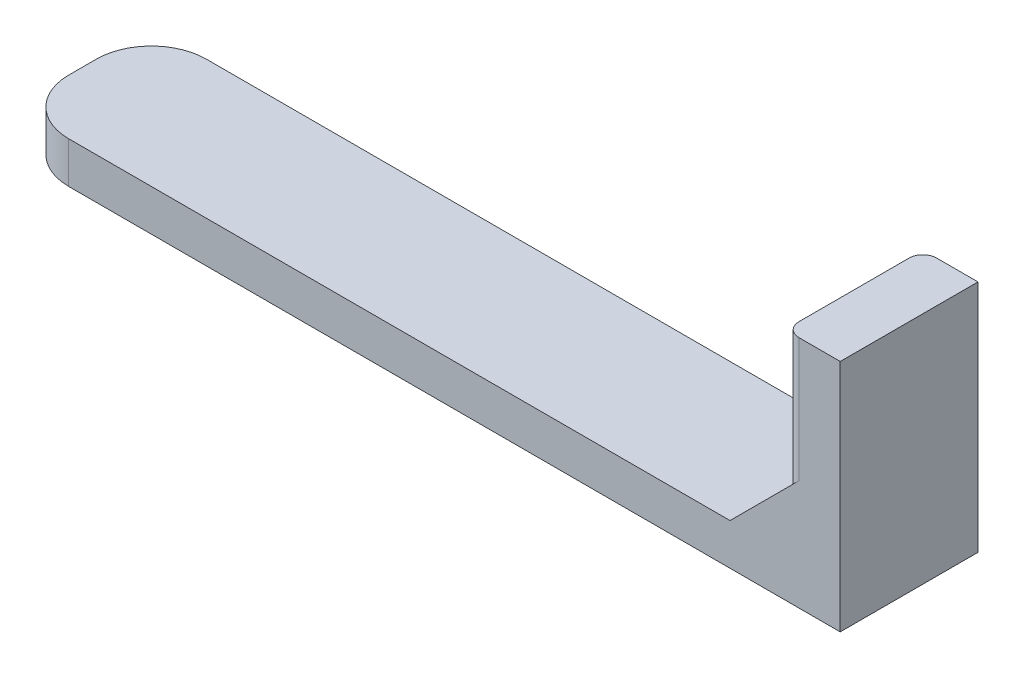
ISO-10303-21;
HEADER;
FILE_DESCRIPTION(('STEP AP214'),'2;1');
FILE_NAME('part.step','',(''),(''),'','','');
FILE_SCHEMA(('AUTOMOTIVE_DESIGN { 1 0 10303 214 1 1 1 1 }'));
ENDSEC;
DATA;
#1=APPLICATION_CONTEXT('core data for automotive mechanical design processes');
#2=APPLICATION_PROTOCOL_DEFINITION('international standard','automotive_design',2000,#1);
#3=PRODUCT_CONTEXT('',#1,'mechanical');
#4=PRODUCT('Part','Part','',(#3));
#5=PRODUCT_RELATED_PRODUCT_CATEGORY('part','',(#4));
#6=PRODUCT_DEFINITION_FORMATION('','',#4);
#7=PRODUCT_DEFINITION_CONTEXT('part definition',#1,'design');
#8=PRODUCT_DEFINITION('design','',#6,#7);
#9=PRODUCT_DEFINITION_SHAPE('','',#8);
#10=(LENGTH_UNIT() NAMED_UNIT(*) SI_UNIT(.MILLI.,.METRE.));
#11=(NAMED_UNIT(*) PLANE_ANGLE_UNIT() SI_UNIT($,.RADIAN.));
#12=(NAMED_UNIT(*) SI_UNIT($,.STERADIAN.) SOLID_ANGLE_UNIT());
#13=UNCERTAINTY_MEASURE_WITH_UNIT(LENGTH_MEASURE(1.E-05),#10,'distance_accuracy_value','');
#14=(GEOMETRIC_REPRESENTATION_CONTEXT(3) GLOBAL_UNCERTAINTY_ASSIGNED_CONTEXT((#13)) GLOBAL_UNIT_ASSIGNED_CONTEXT((#10,
#11,#12)) REPRESENTATION_CONTEXT('',''));
#15=CARTESIAN_POINT('',(0.,0.,0.));
#16=DIRECTION('',(0.,0.,1.));
#17=DIRECTION('',(1.,0.,0.));
#18=AXIS2_PLACEMENT_3D('',#15,#16,#17);
#19=CARTESIAN_POINT('',(13.5,8.5,-2.));
#20=DIRECTION('',(0.,-1.,0.));
#21=DIRECTION('',(0.,0.,-1.));
#22=AXIS2_PLACEMENT_3D('',#19,#20,#21);
#23=CYLINDRICAL_SURFACE('',#22,0.5);
#24=DIRECTION('',(0.,-1.,0.));
#25=VECTOR('',#24,1.);
#26=CARTESIAN_POINT('',(13.,8.5,-2.));
#27=LINE('',#26,#25);
#28=CARTESIAN_POINT('',(13.,8.5,-2.));
#29=VERTEX_POINT('',#28);
#30=CARTESIAN_POINT('',(13.,3.50000000000001,-2.));
#31=VERTEX_POINT('',#30);
#32=EDGE_CURVE('E196',#29,#31,#27,.T.);
#33=ORIENTED_EDGE('',*,*,#32,.F.);
#34=CARTESIAN_POINT('',(13.5,8.5,-2.));
#35=DIRECTION('',(0.,1.,0.));
#36=DIRECTION('',(0.,0.,1.));
#37=AXIS2_PLACEMENT_3D('',#34,#35,#36);
#38=CIRCLE('',#37,0.5);
#39=CARTESIAN_POINT('',(13.5,8.5,-2.5));
#40=VERTEX_POINT('',#39);
#41=EDGE_CURVE('E40',#40,#29,#38,.T.);
#42=ORIENTED_EDGE('',*,*,#41,.F.);
#43=DIRECTION('',(0.,-1.,0.));
#44=VECTOR('',#43,1.);
#45=CARTESIAN_POINT('',(13.5,1.5,-2.5));
#46=LINE('',#45,#44);
#47=CARTESIAN_POINT('',(13.5,4.00000000000002,-2.5));
#48=VERTEX_POINT('',#47);
#49=EDGE_CURVE('E131',#48,#40,#46,.F.);
#50=ORIENTED_EDGE('',*,*,#49,.F.);
#51=CARTESIAN_POINT('',(13.5,4.00000000000002,-2.));
#52=DIRECTION('',(-0.707106781186551,0.707106781186544,0.));
#53=DIRECTION('',(-0.707106781186544,-0.707106781186551,0.));
#54=AXIS2_PLACEMENT_3D('',#51,#52,#53);
#55=ELLIPSE('',#54,0.707106781186551,0.5);
#56=EDGE_CURVE('E11',#48,#31,#55,.T.);
#57=ORIENTED_EDGE('',*,*,#56,.T.);
#58=EDGE_LOOP('',(#33,#42,#50,#57));
#59=FACE_BOUND('',#58,.T.);
#60=ADVANCED_FACE('F33',(#59),#23,.T.);
#61=CARTESIAN_POINT('',(13.5,8.5,2.));
#62=DIRECTION('',(0.,1.,0.));
#63=DIRECTION('',(0.,0.,1.));
#64=AXIS2_PLACEMENT_3D('',#61,#62,#63);
#65=CYLINDRICAL_SURFACE('',#64,0.5);
#66=DIRECTION('',(0.,1.,0.));
#67=VECTOR('',#66,1.);
#68=CARTESIAN_POINT('',(13.,8.5,2.));
#69=LINE('',#68,#67);
#70=CARTESIAN_POINT('',(13.,3.50000000000001,2.));
#71=VERTEX_POINT('',#70);
#72=CARTESIAN_POINT('',(13.,8.5,2.));
#73=VERTEX_POINT('',#72);
#74=EDGE_CURVE('E185',#71,#73,#69,.T.);
#75=ORIENTED_EDGE('',*,*,#74,.F.);
#76=CARTESIAN_POINT('',(13.5,4.00000000000002,2.));
#77=DIRECTION('',(-0.707106781186551,0.707106781186544,0.));
#78=DIRECTION('',(0.707106781186544,0.707106781186551,0.));
#79=AXIS2_PLACEMENT_3D('',#76,#77,#78);
#80=ELLIPSE('',#79,0.707106781186551,0.5);
#81=CARTESIAN_POINT('',(13.5,4.00000000000002,2.5));
#82=VERTEX_POINT('',#81);
#83=EDGE_CURVE('E193',#71,#82,#80,.T.);
#84=ORIENTED_EDGE('',*,*,#83,.T.);
#85=DIRECTION('',(0.,1.,0.));
#86=VECTOR('',#85,1.);
#87=CARTESIAN_POINT('',(13.5,1.5,2.5));
#88=LINE('',#87,#86);
#89=CARTESIAN_POINT('',(13.5,8.5,2.5));
#90=VERTEX_POINT('',#89);
#91=EDGE_CURVE('E188',#90,#82,#88,.F.);
#92=ORIENTED_EDGE('',*,*,#91,.F.);
#93=CARTESIAN_POINT('',(13.5,8.5,2.));
#94=DIRECTION('',(0.,1.,0.));
#95=DIRECTION('',(0.,0.,1.));
#96=AXIS2_PLACEMENT_3D('',#93,#94,#95);
#97=CIRCLE('',#96,0.5);
#98=EDGE_CURVE('E191',#73,#90,#97,.T.);
#99=ORIENTED_EDGE('',*,*,#98,.F.);
#100=EDGE_LOOP('',(#75,#84,#92,#99));
#101=FACE_BOUND('',#100,.T.);
#102=ADVANCED_FACE('F207',(#101),#65,.T.);
#103=CARTESIAN_POINT('',(-13.,1.5,-0.5));
#104=DIRECTION('',(0.,1.,0.));
#105=DIRECTION('',(0.,0.,1.));
#106=AXIS2_PLACEMENT_3D('',#103,#104,#105);
#107=CYLINDRICAL_SURFACE('',#106,2.);
#108=DIRECTION('',(0.,1.,0.));
#109=VECTOR('',#108,1.);
#110=CARTESIAN_POINT('',(-13.,1.5,-2.5));
#111=LINE('',#110,#109);
#112=CARTESIAN_POINT('',(-13.,0.,-2.5));
#113=VERTEX_POINT('',#112);
#114=CARTESIAN_POINT('',(-13.,1.5,-2.5));
#115=VERTEX_POINT('',#114);
#116=EDGE_CURVE('E168',#113,#115,#111,.T.);
#117=ORIENTED_EDGE('',*,*,#116,.F.);
#118=CARTESIAN_POINT('',(-13.,0.,-0.5));
#119=DIRECTION('',(0.,-1.,0.));
#120=DIRECTION('',(0.,0.,-1.));
#121=AXIS2_PLACEMENT_3D('',#118,#119,#120);
#122=CIRCLE('',#121,2.);
#123=CARTESIAN_POINT('',(-15.,0.,-0.5));
#124=VERTEX_POINT('',#123);
#125=EDGE_CURVE('E174',#124,#113,#122,.T.);
#126=ORIENTED_EDGE('',*,*,#125,.F.);
#127=DIRECTION('',(0.,1.,0.));
#128=VECTOR('',#127,1.);
#129=CARTESIAN_POINT('',(-15.,1.5,-0.5));
#130=LINE('',#129,#128);
#131=CARTESIAN_POINT('',(-15.,1.5,-0.5));
#132=VERTEX_POINT('',#131);
#133=EDGE_CURVE('E171',#132,#124,#130,.F.);
#134=ORIENTED_EDGE('',*,*,#133,.F.);
#135=CARTESIAN_POINT('',(-13.,1.5,-0.5));
#136=DIRECTION('',(0.,-1.,0.));
#137=DIRECTION('',(0.,0.,-1.));
#138=AXIS2_PLACEMENT_3D('',#135,#136,#137);
#139=CIRCLE('',#138,2.);
#140=EDGE_CURVE('E176',#115,#132,#139,.F.);
#141=ORIENTED_EDGE('',*,*,#140,.F.);
#142=EDGE_LOOP('',(#117,#126,#134,#141));
#143=FACE_BOUND('',#142,.T.);
#144=ADVANCED_FACE('F218',(#143),#107,.T.);
#145=CARTESIAN_POINT('',(-13.,1.5,0.5));
#146=DIRECTION('',(0.,-1.,0.));
#147=DIRECTION('',(0.,0.,-1.));
#148=AXIS2_PLACEMENT_3D('',#145,#146,#147);
#149=CYLINDRICAL_SURFACE('',#148,2.);
#150=DIRECTION('',(0.,-1.,0.));
#151=VECTOR('',#150,1.);
#152=CARTESIAN_POINT('',(-13.,1.5,2.5));
#153=LINE('',#152,#151);
#154=CARTESIAN_POINT('',(-13.,1.5,2.5));
#155=VERTEX_POINT('',#154);
#156=CARTESIAN_POINT('',(-13.,0.,2.5));
#157=VERTEX_POINT('',#156);
#158=EDGE_CURVE('E125',#155,#157,#153,.T.);
#159=ORIENTED_EDGE('',*,*,#158,.F.);
#160=CARTESIAN_POINT('',(-13.,1.5,0.5));
#161=DIRECTION('',(0.,-1.,0.));
#162=DIRECTION('',(0.,0.,-1.));
#163=AXIS2_PLACEMENT_3D('',#160,#161,#162);
#164=CIRCLE('',#163,2.);
#165=CARTESIAN_POINT('',(-15.,1.5,0.5));
#166=VERTEX_POINT('',#165);
#167=EDGE_CURVE('E163',#166,#155,#164,.F.);
#168=ORIENTED_EDGE('',*,*,#167,.F.);
#169=DIRECTION('',(0.,-1.,0.));
#170=VECTOR('',#169,1.);
#171=CARTESIAN_POINT('',(-15.,1.5,0.5));
#172=LINE('',#171,#170);
#173=CARTESIAN_POINT('',(-15.,0.,0.5));
#174=VERTEX_POINT('',#173);
#175=EDGE_CURVE('E160',#174,#166,#172,.F.);
#176=ORIENTED_EDGE('',*,*,#175,.F.);
#177=CARTESIAN_POINT('',(-13.,0.,0.5));
#178=DIRECTION('',(0.,-1.,0.));
#179=DIRECTION('',(0.,0.,-1.));
#180=AXIS2_PLACEMENT_3D('',#177,#178,#179);
#181=CIRCLE('',#180,2.);
#182=EDGE_CURVE('E165',#157,#174,#181,.T.);
#183=ORIENTED_EDGE('',*,*,#182,.F.);
#184=EDGE_LOOP('',(#159,#168,#176,#183));
#185=FACE_BOUND('',#184,.T.);
#186=ADVANCED_FACE('F230',(#185),#149,.T.);
#187=CARTESIAN_POINT('',(0.,1.5,0.));
#188=DIRECTION('',(0.,-1.,0.));
#189=DIRECTION('',(0.,0.,-1.));
#190=AXIS2_PLACEMENT_3D('',#187,#188,#189);
#191=PLANE('',#190);
#192=DIRECTION('',(1.,0.,0.));
#193=VECTOR('',#192,1.);
#194=CARTESIAN_POINT('',(-15.,1.5,2.5));
#195=LINE('',#194,#193);
#196=CARTESIAN_POINT('',(11.,1.5,2.5));
#197=VERTEX_POINT('',#196);
#198=EDGE_CURVE('E148',#155,#197,#195,.T.);
#199=ORIENTED_EDGE('',*,*,#198,.T.);
#200=DIRECTION('',(0.,0.,-1.));
#201=VECTOR('',#200,1.);
#202=CARTESIAN_POINT('',(11.,1.5,-2.5));
#203=LINE('',#202,#201);
#204=CARTESIAN_POINT('',(11.,1.5,-2.5));
#205=VERTEX_POINT('',#204);
#206=EDGE_CURVE('E180',#197,#205,#203,.T.);
#207=ORIENTED_EDGE('',*,*,#206,.T.);
#208=DIRECTION('',(-1.,0.,0.));
#209=VECTOR('',#208,1.);
#210=CARTESIAN_POINT('',(-15.,1.5,-2.5));
#211=LINE('',#210,#209);
#212=EDGE_CURVE('E143',#205,#115,#211,.T.);
#213=ORIENTED_EDGE('',*,*,#212,.T.);
#214=ORIENTED_EDGE('',*,*,#140,.T.);
#215=DIRECTION('',(0.,0.,1.));
#216=VECTOR('',#215,1.);
#217=CARTESIAN_POINT('',(-15.,1.5,2.5));
#218=LINE('',#217,#216);
#219=EDGE_CURVE('E145',#132,#166,#218,.T.);
#220=ORIENTED_EDGE('',*,*,#219,.T.);
#221=ORIENTED_EDGE('',*,*,#167,.T.);
#222=EDGE_LOOP('',(#199,#207,#213,#214,#220,#221));
#223=FACE_BOUND('',#222,.T.);
#224=ADVANCED_FACE('F222',(#223),#191,.F.);
#225=CARTESIAN_POINT('',(15.,1.5,2.5));
#226=DIRECTION('',(-1.,0.,0.));
#227=DIRECTION('',(0.,0.,1.));
#228=AXIS2_PLACEMENT_3D('',#225,#226,#227);
#229=PLANE('',#228);
#230=DIRECTION('',(0.,0.,-1.));
#231=VECTOR('',#230,1.);
#232=CARTESIAN_POINT('',(15.,0.,2.5));
#233=LINE('',#232,#231);
#234=CARTESIAN_POINT('',(15.,0.,2.5));
#235=VERTEX_POINT('',#234);
#236=CARTESIAN_POINT('',(15.,0.,-2.5));
#237=VERTEX_POINT('',#236);
#238=EDGE_CURVE('E123',#235,#237,#233,.T.);
#239=ORIENTED_EDGE('',*,*,#238,.T.);
#240=DIRECTION('',(0.,-1.,0.));
#241=VECTOR('',#240,1.);
#242=CARTESIAN_POINT('',(15.,1.5,-2.5));
#243=LINE('',#242,#241);
#244=CARTESIAN_POINT('',(15.,8.5,-2.5));
#245=VERTEX_POINT('',#244);
#246=EDGE_CURVE('E116',#245,#237,#243,.T.);
#247=ORIENTED_EDGE('',*,*,#246,.F.);
#248=DIRECTION('',(0.,0.,-1.));
#249=VECTOR('',#248,1.);
#250=CARTESIAN_POINT('',(15.,8.5,2.5));
#251=LINE('',#250,#249);
#252=CARTESIAN_POINT('',(15.,8.5,2.5));
#253=VERTEX_POINT('',#252);
#254=EDGE_CURVE('E121',#253,#245,#251,.T.);
#255=ORIENTED_EDGE('',*,*,#254,.F.);
#256=DIRECTION('',(0.,-1.,0.));
#257=VECTOR('',#256,1.);
#258=CARTESIAN_POINT('',(15.,1.5,2.5));
#259=LINE('',#258,#257);
#260=EDGE_CURVE('E126',#253,#235,#259,.T.);
#261=ORIENTED_EDGE('',*,*,#260,.T.);
#262=EDGE_LOOP('',(#239,#247,#255,#261));
#263=FACE_BOUND('',#262,.T.);
#264=ADVANCED_FACE('F118',(#263),#229,.F.);
#265=CARTESIAN_POINT('',(-15.,1.5,-2.5));
#266=DIRECTION('',(0.,0.,1.));
#267=DIRECTION('',(1.,0.,0.));
#268=AXIS2_PLACEMENT_3D('',#265,#266,#267);
#269=PLANE('',#268);
#270=DIRECTION('',(-0.707106781186544,-0.707106781186551,0.));
#271=VECTOR('',#270,1.);
#272=CARTESIAN_POINT('',(-1.99999999999986,-11.5,-2.5));
#273=LINE('',#272,#271);
#274=EDGE_CURVE('E47',#205,#48,#273,.F.);
#275=ORIENTED_EDGE('',*,*,#274,.T.);
#276=ORIENTED_EDGE('',*,*,#49,.T.);
#277=DIRECTION('',(-1.,0.,0.));
#278=VECTOR('',#277,1.);
#279=CARTESIAN_POINT('',(15.,8.5,-2.5));
#280=LINE('',#279,#278);
#281=EDGE_CURVE('E129',#245,#40,#280,.T.);
#282=ORIENTED_EDGE('',*,*,#281,.F.);
#283=ORIENTED_EDGE('',*,*,#246,.T.);
#284=DIRECTION('',(-1.,0.,0.));
#285=VECTOR('',#284,1.);
#286=CARTESIAN_POINT('',(-15.,0.,-2.5));
#287=LINE('',#286,#285);
#288=EDGE_CURVE('E152',#237,#113,#287,.T.);
#289=ORIENTED_EDGE('',*,*,#288,.T.);
#290=ORIENTED_EDGE('',*,*,#116,.T.);
#291=ORIENTED_EDGE('',*,*,#212,.F.);
#292=EDGE_LOOP('',(#275,#276,#282,#283,#289,#290,#291));
#293=FACE_BOUND('',#292,.T.);
#294=ADVANCED_FACE('F130',(#293),#269,.F.);
#295=CARTESIAN_POINT('',(-15.,1.5,2.5));
#296=DIRECTION('',(1.,0.,0.));
#297=DIRECTION('',(0.,0.,-1.));
#298=AXIS2_PLACEMENT_3D('',#295,#296,#297);
#299=PLANE('',#298);
#300=ORIENTED_EDGE('',*,*,#219,.F.);
#301=ORIENTED_EDGE('',*,*,#133,.T.);
#302=DIRECTION('',(0.,0.,1.));
#303=VECTOR('',#302,1.);
#304=CARTESIAN_POINT('',(-15.,0.,2.5));
#305=LINE('',#304,#303);
#306=EDGE_CURVE('E154',#124,#174,#305,.T.);
#307=ORIENTED_EDGE('',*,*,#306,.T.);
#308=ORIENTED_EDGE('',*,*,#175,.T.);
#309=EDGE_LOOP('',(#300,#301,#307,#308));
#310=FACE_BOUND('',#309,.T.);
#311=ADVANCED_FACE('F233',(#310),#299,.F.);
#312=CARTESIAN_POINT('',(-15.,1.5,2.5));
#313=DIRECTION('',(0.,0.,-1.));
#314=DIRECTION('',(-1.,0.,0.));
#315=AXIS2_PLACEMENT_3D('',#312,#313,#314);
#316=PLANE('',#315);
#317=DIRECTION('',(1.,0.,0.));
#318=VECTOR('',#317,1.);
#319=CARTESIAN_POINT('',(15.,8.5,2.5));
#320=LINE('',#319,#318);
#321=EDGE_CURVE('E137',#90,#253,#320,.T.);
#322=ORIENTED_EDGE('',*,*,#321,.F.);
#323=ORIENTED_EDGE('',*,*,#91,.T.);
#324=DIRECTION('',(0.707106781186544,0.707106781186551,0.));
#325=VECTOR('',#324,1.);
#326=CARTESIAN_POINT('',(-1.99999999999986,-11.5,2.5));
#327=LINE('',#326,#325);
#328=EDGE_CURVE('E182',#82,#197,#327,.F.);
#329=ORIENTED_EDGE('',*,*,#328,.T.);
#330=ORIENTED_EDGE('',*,*,#198,.F.);
#331=ORIENTED_EDGE('',*,*,#158,.T.);
#332=DIRECTION('',(1.,0.,0.));
#333=VECTOR('',#332,1.);
#334=CARTESIAN_POINT('',(-15.,0.,2.5));
#335=LINE('',#334,#333);
#336=EDGE_CURVE('E146',#157,#235,#335,.T.);
#337=ORIENTED_EDGE('',*,*,#336,.T.);
#338=ORIENTED_EDGE('',*,*,#260,.F.);
#339=EDGE_LOOP('',(#322,#323,#329,#330,#331,#337,#338));
#340=FACE_BOUND('',#339,.T.);
#341=ADVANCED_FACE('F210',(#340),#316,.F.);
#342=CARTESIAN_POINT('',(0.,0.,0.));
#343=DIRECTION('',(0.,-1.,0.));
#344=DIRECTION('',(0.,0.,-1.));
#345=AXIS2_PLACEMENT_3D('',#342,#343,#344);
#346=PLANE('',#345);
#347=ORIENTED_EDGE('',*,*,#306,.F.);
#348=ORIENTED_EDGE('',*,*,#125,.T.);
#349=ORIENTED_EDGE('',*,*,#288,.F.);
#350=ORIENTED_EDGE('',*,*,#238,.F.);
#351=ORIENTED_EDGE('',*,*,#336,.F.);
#352=ORIENTED_EDGE('',*,*,#182,.T.);
#353=EDGE_LOOP('',(#347,#348,#349,#350,#351,#352));
#354=FACE_BOUND('',#353,.T.);
#355=ADVANCED_FACE('F214',(#354),#346,.T.);
#356=CARTESIAN_POINT('',(13.,8.5,2.5));
#357=DIRECTION('',(1.,0.,0.));
#358=DIRECTION('',(0.,0.,-1.));
#359=AXIS2_PLACEMENT_3D('',#356,#357,#358);
#360=PLANE('',#359);
#361=DIRECTION('',(0.,0.,1.));
#362=VECTOR('',#361,1.);
#363=CARTESIAN_POINT('',(13.,8.5,2.5));
#364=LINE('',#363,#362);
#365=EDGE_CURVE('E133',#29,#73,#364,.T.);
#366=ORIENTED_EDGE('',*,*,#365,.F.);
#367=ORIENTED_EDGE('',*,*,#32,.T.);
#368=DIRECTION('',(0.,0.,1.));
#369=VECTOR('',#368,1.);
#370=CARTESIAN_POINT('',(13.,3.50000000000001,2.5));
#371=LINE('',#370,#369);
#372=EDGE_CURVE('E178',#31,#71,#371,.T.);
#373=ORIENTED_EDGE('',*,*,#372,.T.);
#374=ORIENTED_EDGE('',*,*,#74,.T.);
#375=EDGE_LOOP('',(#366,#367,#373,#374));
#376=FACE_BOUND('',#375,.T.);
#377=ADVANCED_FACE('F203',(#376),#360,.F.);
#378=CARTESIAN_POINT('',(0.,8.5,0.));
#379=DIRECTION('',(0.,1.,0.));
#380=DIRECTION('',(0.,0.,1.));
#381=AXIS2_PLACEMENT_3D('',#378,#379,#380);
#382=PLANE('',#381);
#383=ORIENTED_EDGE('',*,*,#281,.T.);
#384=ORIENTED_EDGE('',*,*,#41,.T.);
#385=ORIENTED_EDGE('',*,*,#365,.T.);
#386=ORIENTED_EDGE('',*,*,#98,.T.);
#387=ORIENTED_EDGE('',*,*,#321,.T.);
#388=ORIENTED_EDGE('',*,*,#254,.T.);
#389=EDGE_LOOP('',(#383,#384,#385,#386,#387,#388));
#390=FACE_BOUND('',#389,.T.);
#391=ADVANCED_FACE('F135',(#390),#382,.T.);
#392=CARTESIAN_POINT('',(13.,3.50000000000001,2.5));
#393=DIRECTION('',(-0.707106781186551,0.707106781186544,0.));
#394=DIRECTION('',(0.,0.,-1.));
#395=AXIS2_PLACEMENT_3D('',#392,#393,#394);
#396=PLANE('',#395);
#397=ORIENTED_EDGE('',*,*,#274,.F.);
#398=ORIENTED_EDGE('',*,*,#206,.F.);
#399=ORIENTED_EDGE('',*,*,#328,.F.);
#400=ORIENTED_EDGE('',*,*,#83,.F.);
#401=ORIENTED_EDGE('',*,*,#372,.F.);
#402=ORIENTED_EDGE('',*,*,#56,.F.);
#403=EDGE_LOOP('',(#397,#398,#399,#400,#401,#402));
#404=FACE_BOUND('',#403,.T.);
#405=ADVANCED_FACE('F227',(#404),#396,.T.);
#406=CLOSED_SHELL('',(#60,#102,#144,#186,#224,#264,#294,#311,#341,#355,#377,#391,#405));
#407=MANIFOLD_SOLID_BREP('B2',#406);
#408=ADVANCED_BREP_SHAPE_REPRESENTATION('',(#18,#407),#14);
#409=SHAPE_DEFINITION_REPRESENTATION(#9,#408);
ENDSEC;
END-ISO-10303-21;
